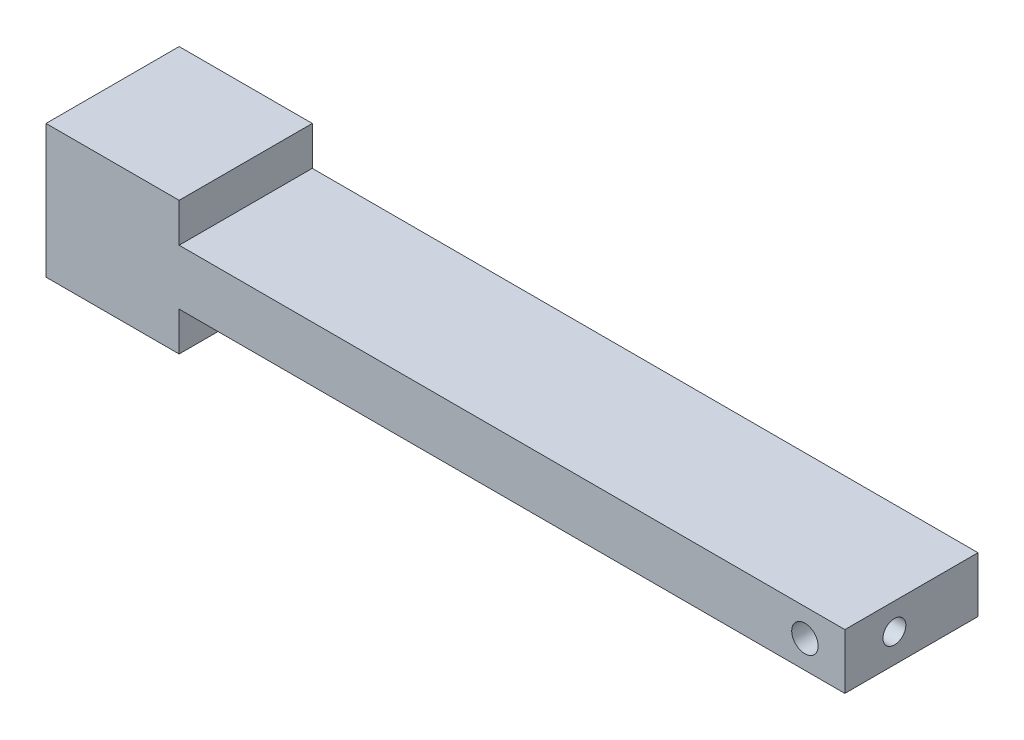
ISO-10303-21;
HEADER;
FILE_DESCRIPTION(('STEP AP214'),'2;1');
FILE_NAME('part.step','',(''),(''),'','','');
FILE_SCHEMA(('AUTOMOTIVE_DESIGN { 1 0 10303 214 1 1 1 1 }'));
ENDSEC;
DATA;
#1=APPLICATION_CONTEXT('core data for automotive mechanical design processes');
#2=APPLICATION_PROTOCOL_DEFINITION('international standard','automotive_design',2000,#1);
#3=PRODUCT_CONTEXT('',#1,'mechanical');
#4=PRODUCT('Part','Part','',(#3));
#5=PRODUCT_RELATED_PRODUCT_CATEGORY('part','',(#4));
#6=PRODUCT_DEFINITION_FORMATION('','',#4);
#7=PRODUCT_DEFINITION_CONTEXT('part definition',#1,'design');
#8=PRODUCT_DEFINITION('design','',#6,#7);
#9=PRODUCT_DEFINITION_SHAPE('','',#8);
#10=(LENGTH_UNIT() NAMED_UNIT(*) SI_UNIT(.MILLI.,.METRE.));
#11=(NAMED_UNIT(*) PLANE_ANGLE_UNIT() SI_UNIT($,.RADIAN.));
#12=(NAMED_UNIT(*) SI_UNIT($,.STERADIAN.) SOLID_ANGLE_UNIT());
#13=UNCERTAINTY_MEASURE_WITH_UNIT(LENGTH_MEASURE(1.E-05),#10,'distance_accuracy_value','');
#14=(GEOMETRIC_REPRESENTATION_CONTEXT(3) GLOBAL_UNCERTAINTY_ASSIGNED_CONTEXT((#13)) GLOBAL_UNIT_ASSIGNED_CONTEXT((#10,
#11,#12)) REPRESENTATION_CONTEXT('',''));
#15=CARTESIAN_POINT('',(0.,0.,0.));
#16=DIRECTION('',(0.,0.,1.));
#17=DIRECTION('',(1.,0.,0.));
#18=AXIS2_PLACEMENT_3D('',#15,#16,#17);
#19=CARTESIAN_POINT('',(40.0000009685755,4.15400019846857,19.9999995541531));
#20=DIRECTION('',(-3.77823637145314E-11,9.00669295250083E-11,1.));
#21=DIRECTION('',(0.,-1.,9.00669295250083E-11));
#22=AXIS2_PLACEMENT_3D('',#19,#20,#21);
#23=PLANE('',#22);
#24=CARTESIAN_POINT('',(94.0004476169617,4.15289091259568,19.9999995561934));
#25=DIRECTION('',(-3.77823637145314E-11,9.00669295250083E-11,1.));
#26=DIRECTION('',(-0.577645664501033,-0.816287624727437,5.16957013741623E-11));
#27=AXIS2_PLACEMENT_3D('',#24,#25,#26);
#28=ELLIPSE('',#27,1.98529051655077,1.98529051504016);
#29=CARTESIAN_POINT('',(92.8536531573011,2.53232283244655,19.9999995562961));
#30=VERTEX_POINT('',#29);
#31=EDGE_CURVE('E64',#30,#30,#28,.T.);
#32=ORIENTED_EDGE('',*,*,#31,.F.);
#33=EDGE_LOOP('',(#32));
#34=FACE_BOUND('',#33,.T.);
#35=DIRECTION('',(0.,-1.,9.00669295250083E-11));
#36=VECTOR('',#35,1.);
#37=CARTESIAN_POINT('',(-19.9999995529652,4.15400019936923,19.9999995518861));
#38=LINE('',#37,#36);
#39=CARTESIAN_POINT('',(-19.9999995529652,-5.84599981084466,19.9999995527868));
#40=VERTEX_POINT('',#39);
#41=CARTESIAN_POINT('',(-19.9999995529652,14.1540002077818,19.9999995509855));
#42=VERTEX_POINT('',#41);
#43=EDGE_CURVE('E135',#40,#42,#38,.F.);
#44=ORIENTED_EDGE('',*,*,#43,.F.);
#45=DIRECTION('',(1.,0.,3.77823637145314E-11));
#46=VECTOR('',#45,1.);
#47=CARTESIAN_POINT('',(-9.9999997768604,-5.84599981084466,19.9999995531646));
#48=LINE('',#47,#46);
#49=CARTESIAN_POINT('',(0.,-5.84599981084466,19.9999995535424));
#50=VERTEX_POINT('',#49);
#51=EDGE_CURVE('E143',#50,#40,#48,.F.);
#52=ORIENTED_EDGE('',*,*,#51,.F.);
#53=DIRECTION('',(0.,-1.,9.00669295250083E-11));
#54=VECTOR('',#53,1.);
#55=CARTESIAN_POINT('',(0.,-2.92299990452166,19.9999995532792));
#56=LINE('',#55,#54);
#57=CARTESIAN_POINT('',(0.,0.,19.9999995530159));
#58=VERTEX_POINT('',#57);
#59=EDGE_CURVE('E194',#58,#50,#56,.T.);
#60=ORIENTED_EDGE('',*,*,#59,.F.);
#61=DIRECTION('',(1.,0.,3.77823637145314E-11));
#62=VECTOR('',#61,1.);
#63=CARTESIAN_POINT('',(50.0000007446802,0.,19.999999554905));
#64=LINE('',#63,#62);
#65=CARTESIAN_POINT('',(100.000001490116,0.,19.9999995567941));
#66=VERTEX_POINT('',#65);
#67=EDGE_CURVE('E198',#66,#58,#64,.F.);
#68=ORIENTED_EDGE('',*,*,#67,.F.);
#69=DIRECTION('',(0.,-1.,9.00669295250083E-11));
#70=VECTOR('',#69,1.);
#71=CARTESIAN_POINT('',(100.000001490116,4.15399996653859,19.99999955642));
#72=LINE('',#71,#70);
#73=CARTESIAN_POINT('',(100.000001490116,8.30799993127584,19.9999995560459));
#74=VERTEX_POINT('',#73);
#75=EDGE_CURVE('E210',#74,#66,#72,.T.);
#76=ORIENTED_EDGE('',*,*,#75,.F.);
#77=DIRECTION('',(-1.,0.,-3.77823637145314E-11));
#78=VECTOR('',#77,1.);
#79=CARTESIAN_POINT('',(50.0000007446802,8.30799993127584,19.9999995541568));
#80=LINE('',#79,#78);
#81=CARTESIAN_POINT('',(0.,8.30799993127584,19.9999995522676));
#82=VERTEX_POINT('',#81);
#83=EDGE_CURVE('E184',#82,#74,#80,.F.);
#84=ORIENTED_EDGE('',*,*,#83,.F.);
#85=DIRECTION('',(0.,-1.,9.00669295250083E-11));
#86=VECTOR('',#85,1.);
#87=CARTESIAN_POINT('',(0.,11.2310000704295,19.9999995520044));
#88=LINE('',#87,#86);
#89=CARTESIAN_POINT('',(0.,14.1540002077818,19.9999995517411));
#90=VERTEX_POINT('',#89);
#91=EDGE_CURVE('E180',#90,#82,#88,.T.);
#92=ORIENTED_EDGE('',*,*,#91,.F.);
#93=DIRECTION('',(-1.,0.,-3.77823637145314E-11));
#94=VECTOR('',#93,1.);
#95=CARTESIAN_POINT('',(-9.9999997768604,14.1540002077818,19.9999995513633));
#96=LINE('',#95,#94);
#97=EDGE_CURVE('E110',#42,#90,#96,.F.);
#98=ORIENTED_EDGE('',*,*,#97,.F.);
#99=EDGE_LOOP('',(#44,#52,#60,#68,#76,#84,#92,#98));
#100=FACE_BOUND('',#99,.T.);
#101=ADVANCED_FACE('F54',(#34,#100),#23,.T.);
#102=CARTESIAN_POINT('',(0.,11.2310000695288,9.99999977648258));
#103=DIRECTION('',(1.,0.,0.));
#104=DIRECTION('',(0.,0.,-1.));
#105=AXIS2_PLACEMENT_3D('',#102,#103,#104);
#106=PLANE('',#105);
#107=DIRECTION('',(0.,0.,-1.));
#108=VECTOR('',#107,1.);
#109=CARTESIAN_POINT('',(0.,8.30799993127584,9.99999977648258));
#110=LINE('',#109,#108);
#111=CARTESIAN_POINT('',(0.,8.30799993127584,-6.53255227689442E-10));
#112=VERTEX_POINT('',#111);
#113=EDGE_CURVE('E95',#112,#82,#110,.F.);
#114=ORIENTED_EDGE('',*,*,#113,.F.);
#115=DIRECTION('',(0.,-1.,1.72519721867234E-10));
#116=VECTOR('',#115,1.);
#117=CARTESIAN_POINT('',(0.,11.2310000678036,-1.15753066853852E-09));
#118=LINE('',#117,#116);
#119=CARTESIAN_POINT('',(0.,14.1540002077818,-1.6618061093876E-09));
#120=VERTEX_POINT('',#119);
#121=EDGE_CURVE('E58',#112,#120,#118,.F.);
#122=ORIENTED_EDGE('',*,*,#121,.T.);
#123=DIRECTION('',(0.,0.,-1.));
#124=VECTOR('',#123,1.);
#125=CARTESIAN_POINT('',(0.,14.1540002077818,9.99999977648258));
#126=LINE('',#125,#124);
#127=EDGE_CURVE('E176',#120,#90,#126,.F.);
#128=ORIENTED_EDGE('',*,*,#127,.T.);
#129=ORIENTED_EDGE('',*,*,#91,.T.);
#130=EDGE_LOOP('',(#114,#122,#128,#129));
#131=FACE_BOUND('',#130,.T.);
#132=ADVANCED_FACE('F256',(#131),#106,.T.);
#133=CARTESIAN_POINT('',(94.0008983016014,4.15352778509259,-7.80098332597845E-05));
#134=DIRECTION('',(-2.25341445740447E-05,-3.18435013226546E-05,0.999999999239102));
#135=DIRECTION('',(0.,-0.999999999492996,-3.18435013307395E-05));
#136=AXIS2_PLACEMENT_3D('',#133,#134,#135);
#137=CYLINDRICAL_SURFACE('',#136,1.98529051504016);
#138=CARTESIAN_POINT('',(92.0213303966296,4.30698918345897,10.840997572822));
#139=CARTESIAN_POINT('',(92.027738209865,4.38935505976686,10.8410049353294));
#140=CARTESIAN_POINT('',(92.03933057658,4.4714053608794,10.8469823661287));
#141=CARTESIAN_POINT('',(92.0722083565678,4.63196335916795,10.8701069849026));
#142=CARTESIAN_POINT('',(92.0935127024591,4.71046380613461,10.8872760181225));
#143=CARTESIAN_POINT('',(92.1442174303557,4.8612106656572,10.9311386446164));
#144=CARTESIAN_POINT('',(92.1735553015237,4.93349992459879,10.9577591496137));
#145=CARTESIAN_POINT('',(92.2387921134833,5.07136199407739,11.0189140991926));
#146=CARTESIAN_POINT('',(92.2746915954768,5.13693424989907,11.0534491966297));
#147=CARTESIAN_POINT('',(92.3687227814682,5.28865864754151,11.1458444358875));
#148=CARTESIAN_POINT('',(92.4296281088826,5.370942306804,11.2072372257263));
#149=CARTESIAN_POINT('',(92.558145026261,5.52078480155987,11.3402953090276));
#150=CARTESIAN_POINT('',(92.6257753051906,5.58830083371534,11.4119894909735));
#151=CARTESIAN_POINT('',(92.7660524846574,5.71072787367784,11.5657669799297));
#152=CARTESIAN_POINT('',(92.8387846596546,5.76525937410873,11.6480744606328));
#153=CARTESIAN_POINT('',(92.9467214224429,5.83615937984344,11.7781012538733));
#154=CARTESIAN_POINT('',(92.9824760749675,5.85796222476029,11.8224961994024));
#155=CARTESIAN_POINT('',(93.052670587892,5.89796142998643,11.9138588112465));
#156=CARTESIAN_POINT('',(93.087111484775,5.91616068292434,11.9608243751332));
#157=CARTESIAN_POINT('',(93.146624184707,5.94561039634848,12.0484202705445));
#158=CARTESIAN_POINT('',(93.1722058171645,5.95752351241561,12.0884780862943));
#159=CARTESIAN_POINT('',(93.2201066608229,5.97875044831453,12.1712370798607));
#160=CARTESIAN_POINT('',(93.2424257575983,5.98806417698947,12.2139383503155));
#161=CARTESIAN_POINT('',(93.2776205739836,6.00217362000559,12.2939928119583));
#162=CARTESIAN_POINT('',(93.291486295163,6.00749307055044,12.3308031441124));
#163=CARTESIAN_POINT('',(93.3135584574533,6.01578363862988,12.4062883060213));
#164=CARTESIAN_POINT('',(93.3217854455289,6.01876328800818,12.4449558110389));
#165=CARTESIAN_POINT('',(93.3309164307503,6.02206210278586,12.5238292036585));
#166=CARTESIAN_POINT('',(93.331725793991,6.0223468886562,12.5640484144963));
#167=CARTESIAN_POINT('',(93.3255396993505,6.02011755088474,12.6438223891513));
#168=CARTESIAN_POINT('',(93.3185299365359,6.01759829732769,12.6833758003233));
#169=CARTESIAN_POINT('',(93.2959136337359,6.00917893088506,12.7699747053243));
#170=CARTESIAN_POINT('',(93.2786245135109,6.0026029185691,12.8164881569458));
#171=CARTESIAN_POINT('',(93.2382613379378,5.98633294310751,12.9064054225882));
#172=CARTESIAN_POINT('',(93.215162208446,5.9766254126568,12.9497946817207));
#173=CARTESIAN_POINT('',(93.1632646907293,5.95342556227288,13.0380577171385));
#174=CARTESIAN_POINT('',(93.1341286246761,5.93965394635518,13.0826541726011));
#175=CARTESIAN_POINT('',(93.0737569228028,5.90909568603756,13.1693457886071));
#176=CARTESIAN_POINT('',(93.0425190185769,5.89230575037178,13.2114381512553));
#177=CARTESIAN_POINT('',(92.9472920209854,5.83752095411522,13.3347114804561));
#178=CARTESIAN_POINT('',(92.8818283119401,5.7951272094196,13.412830030942));
#179=CARTESIAN_POINT('',(92.7419861693271,5.69128424426149,13.5733069210783));
#180=CARTESIAN_POINT('',(92.6677398773525,5.62793268818409,13.6545499796976));
#181=CARTESIAN_POINT('',(92.5247616543543,5.48482132953397,13.8067148432776));
#182=CARTESIAN_POINT('',(92.456018474537,5.40509625103739,13.8776579570345));
#183=CARTESIAN_POINT('',(92.345232104433,5.25199908949161,13.9892087001723));
#184=CARTESIAN_POINT('',(92.3009305307541,5.1825036863088,14.0328809736327));
#185=CARTESIAN_POINT('',(92.219725119699,5.03456816627114,14.111078601178));
#186=CARTESIAN_POINT('',(92.1828127400084,4.956138544453,14.1456145324089));
#187=CARTESIAN_POINT('',(92.1236915483699,4.8044009841975,14.1987534942452));
#188=CARTESIAN_POINT('',(92.1000841366074,4.73222210889643,14.2190067025169));
#189=CARTESIAN_POINT('',(92.061039862106,4.58371652266952,14.2500495013133));
#190=CARTESIAN_POINT('',(92.0455978915665,4.50739243776512,14.2608450107785));
#191=CARTESIAN_POINT('',(92.0237582292718,4.35236278699525,14.2719949724837));
#192=CARTESIAN_POINT('',(92.0173976801946,4.27364877809186,14.272306662764));
#193=CARTESIAN_POINT('',(92.0140685111104,4.11673344128202,14.2620546010926));
#194=CARTESIAN_POINT('',(92.0170999148315,4.03853211467134,14.2514908216648));
#195=CARTESIAN_POINT('',(92.0314475617143,3.89021556708383,14.2210236351779));
#196=CARTESIAN_POINT('',(92.0422059838271,3.8199067508243,14.2017799615739));
#197=CARTESIAN_POINT('',(92.0703652309547,3.68349453617198,14.1550978621988));
#198=CARTESIAN_POINT('',(92.0877676814574,3.61739217152505,14.1276574314164));
#199=CARTESIAN_POINT('',(92.1297800569342,3.48468160962329,14.0627930715323));
#200=CARTESIAN_POINT('',(92.1549002825522,3.41857059781703,14.0246896942043));
#201=CARTESIAN_POINT('',(92.2098246813798,3.29328977982566,13.9412017866257));
#202=CARTESIAN_POINT('',(92.2396312653027,3.23412357363458,13.8958135086917));
#203=CARTESIAN_POINT('',(92.3087120941268,3.11152627276729,13.7886886781335));
#204=CARTESIAN_POINT('',(92.3486698572646,3.04974124246974,13.7255121160814));
#205=CARTESIAN_POINT('',(92.4299667963198,2.9368062736538,13.5909339105132));
#206=CARTESIAN_POINT('',(92.4713077505971,2.88567068875152,13.5195213650543));
#207=CARTESIAN_POINT('',(92.5493068571313,2.79722994533939,13.3734711134498));
#208=CARTESIAN_POINT('',(92.5860965876383,2.75926665698403,13.2993033959886));
#209=CARTESIAN_POINT('',(92.6537059324242,2.69384438938311,13.1439353113346));
#210=CARTESIAN_POINT('',(92.6845386964181,2.66636213994731,13.0627510202673));
#211=CARTESIAN_POINT('',(92.7273510040933,2.62971452835751,12.9185149747004));
#212=CARTESIAN_POINT('',(92.7422071771655,2.6175427600528,12.8571052089105));
#213=CARTESIAN_POINT('',(92.7639576557527,2.59997434447804,12.7319968811869));
#214=CARTESIAN_POINT('',(92.770869414347,2.59456284329881,12.6683036547041));
#215=CARTESIAN_POINT('',(92.7754749032408,2.59094374522096,12.5400761162616));
#216=CARTESIAN_POINT('',(92.7731279960037,2.59276790681609,12.4755393383103));
#217=CARTESIAN_POINT('',(92.7595977072045,2.60351896108005,12.3479708402922));
#218=CARTESIAN_POINT('',(92.7484000113996,2.6124573596571,12.2849417288212));
#219=CARTESIAN_POINT('',(92.7146414903433,2.6404519803462,12.1432769694936));
#220=CARTESIAN_POINT('',(92.6896696647932,2.66174919317962,12.0656796350652));
#221=CARTESIAN_POINT('',(92.6327289050362,2.71380292574242,11.9163957775586));
#222=CARTESIAN_POINT('',(92.6007377940588,2.74458955407794,11.8447290027877));
#223=CARTESIAN_POINT('',(92.5209434154715,2.82788666538825,11.6815850306647));
#224=CARTESIAN_POINT('',(92.4717090896213,2.88421426587905,11.5927560300024));
#225=CARTESIAN_POINT('',(92.3739697891802,3.0121894754502,11.4265766020635));
#226=CARTESIAN_POINT('',(92.3254643491604,3.08382682118419,11.3492185434569));
#227=CARTESIAN_POINT('',(92.2429607975443,3.22720059106249,11.2208434600181));
#228=CARTESIAN_POINT('',(92.2079528173076,3.29636392914107,11.1676107983989));
#229=CARTESIAN_POINT('',(92.1445545783634,3.44414202995463,11.0712652960687));
#230=CARTESIAN_POINT('',(92.1161550634513,3.52274333634721,11.0281383001691));
#231=CARTESIAN_POINT('',(92.0726874167448,3.67416192730843,10.9602481911912));
#232=CARTESIAN_POINT('',(92.0561797723851,3.74572489669781,10.9336157451265));
#233=CARTESIAN_POINT('',(92.0310761737774,3.89300168185002,10.8899548197083));
#234=CARTESIAN_POINT('',(92.0224653426652,3.96870740660677,10.8729083048924));
#235=CARTESIAN_POINT('',(92.0159376375952,4.08863549231317,10.8543900446725));
#236=CARTESIAN_POINT('',(92.0149944886588,4.13218679669448,10.8493680421251));
#237=CARTESIAN_POINT('',(92.0159911454471,4.21951803981058,10.842669617975));
#238=CARTESIAN_POINT('',(92.0179313569666,4.26329800986291,10.8409936673626));
#239=CARTESIAN_POINT('',(92.0213303966296,4.30698918345897,10.840997572822));
#240=B_SPLINE_CURVE_WITH_KNOTS('',3,(#138,#139,#140,#141,#142,#143,#144,#145,#146,#147,#148,
#149,#150,#151,#152,#153,#154,#155,#156,#157,#158,#159,#160,#161,#162,#163,#164,#165,#166,#167,
#168,#169,#170,#171,#172,#173,#174,#175,#176,#177,#178,#179,#180,#181,#182,#183,#184,#185,#186,
#187,#188,#189,#190,#191,#192,#193,#194,#195,#196,#197,#198,#199,#200,#201,#202,#203,#204,#205,
#206,#207,#208,#209,#210,#211,#212,#213,#214,#215,#216,#217,#218,#219,#220,#221,#222,#223,#224,
#225,#226,#227,#228,#229,#230,#231,#232,#233,#234,#235,#236,#237,#238,#239),.UNSPECIFIED.,.T.,
.F.,(4,2,2,2,2,2,2,2,2,2,2,2,2,2,2,2,2,2,2,2,2,2,2,2,2,2,2,2,2,2,2,2,2,2,2,2,2,2,2,2,2,2,2,2,2,
2,2,2,2,2,4),(0.,0.247648462571328,0.495781771438758,0.742036622718724,0.988311794281035,
1.3444499897393,1.70160714576746,2.06818615462612,2.25115671375789,2.43397980036377,
2.58081876073379,2.72766286989156,2.8463721347269,2.96464650203743,3.08442774285187,
3.20442848095991,3.35376275100567,3.50375290273325,3.66857158740325,3.83357109763575,
4.16378447595075,4.54341930573182,4.92225718974084,5.20110994821745,5.47963845184876,
5.71443861330787,5.94909172387431,6.18470183447159,6.4203125403229,6.64043217036471,
6.86060568808923,7.1007350216334,7.34098828690419,7.63089889416151,7.92119775755323,
8.19360601278087,8.46540589170696,8.65770493413698,8.84958070255151,9.04229957460601,
9.23533076722079,9.48668298131446,9.73884105676556,10.0855507200529,10.4320286811615,
10.7130809433655,10.9937371453484,11.2271400063461,11.4601022492655,11.5914494739296,
11.722815185727),.UNSPECIFIED.);
#241=CARTESIAN_POINT('',(92.0213303966296,4.30698918345897,10.840997572822));
#242=VERTEX_POINT('',#241);
#243=EDGE_CURVE('E218',#242,#242,#240,.T.);
#244=ORIENTED_EDGE('',*,*,#243,.F.);
#245=EDGE_LOOP('',(#244));
#246=FACE_BOUND('',#245,.T.);
#247=CARTESIAN_POINT('',(95.9799776180645,4.30698918345897,10.840997572822));
#248=CARTESIAN_POINT('',(95.9860915322943,4.22829971138774,10.8409985715823));
#249=CARTESIAN_POINT('',(95.9874777103816,4.14923295805796,10.8464504498645));
#250=CARTESIAN_POINT('',(95.9810161694454,3.99298421957096,10.8681441643114));
#251=CARTESIAN_POINT('',(95.973165424143,3.91580286058115,10.8843895359722));
#252=CARTESIAN_POINT('',(95.9492901318784,3.76598396084882,10.9267155194715));
#253=CARTESIAN_POINT('',(95.933305579454,3.69332612132768,10.9527478460646));
#254=CARTESIAN_POINT('',(95.8946431210275,3.55365006008611,11.0134391317675));
#255=CARTESIAN_POINT('',(95.8719616288368,3.48663488476717,11.0481027113219));
#256=CARTESIAN_POINT('',(95.8132785973153,3.33830613795017,11.1373476514968));
#257=CARTESIAN_POINT('',(95.7753450381974,3.25944973067834,11.1947386360714));
#258=CARTESIAN_POINT('',(95.6942235663009,3.11387256397802,11.3203200317625));
#259=CARTESIAN_POINT('',(95.6510245092046,3.04717831658793,11.3885334436252));
#260=CARTESIAN_POINT('',(95.5625063825678,2.92527510715481,11.5355793747854));
#261=CARTESIAN_POINT('',(95.517164258279,2.87027061762383,11.6145665805213));
#262=CARTESIAN_POINT('',(95.4297732187303,2.77360620873031,11.7819642980681));
#263=CARTESIAN_POINT('',(95.3877190784874,2.73192477793723,11.8703593092007));
#264=CARTESIAN_POINT('',(95.3265734699006,2.67519002615395,12.024521147804));
#265=CARTESIAN_POINT('',(95.3045676208009,2.65591193451794,12.0875592691009));
#266=CARTESIAN_POINT('',(95.2676122790774,2.62450987442688,12.2173332467013));
#267=CARTESIAN_POINT('',(95.2526460797145,2.61236895050309,12.284059923892));
#268=CARTESIAN_POINT('',(95.2322553091335,2.59600713870518,12.4208085727007));
#269=CARTESIAN_POINT('',(95.2269423264279,2.59187883777738,12.4908595943113));
#270=CARTESIAN_POINT('',(95.227458186236,2.59228281496815,12.6308958283613));
#271=CARTESIAN_POINT('',(95.2332882041242,2.59681600670919,12.7008810330793));
#272=CARTESIAN_POINT('',(95.2554396127535,2.61462045736827,12.842770614814));
#273=CARTESIAN_POINT('',(95.2724342462025,2.62845387970381,12.9144920979904));
#274=CARTESIAN_POINT('',(95.3141975937577,2.66428593044103,13.0535559935042));
#275=CARTESIAN_POINT('',(95.3389896456191,2.6863091074319,13.1208845174908));
#276=CARTESIAN_POINT('',(95.4056321205979,2.74946280972317,13.2808262394072));
#277=CARTESIAN_POINT('',(95.4500662131481,2.79471901424552,13.3707149208825));
#278=CARTESIAN_POINT('',(95.5414615513268,2.89931671905957,13.5404657257385));
#279=CARTESIAN_POINT('',(95.5884264174857,2.95867883644833,13.6203129088267));
#280=CARTESIAN_POINT('',(95.6811214602273,3.09289011474994,13.7713830079487));
#281=CARTESIAN_POINT('',(95.7267864637607,3.16810624345256,13.8423231303374));
#282=CARTESIAN_POINT('',(95.8107302979362,3.33258186870659,13.9709371450733));
#283=CARTESIAN_POINT('',(95.849029154964,3.42180205609289,14.0286470908992));
#284=CARTESIAN_POINT('',(95.9042006749714,3.5849896221404,14.1133060314457));
#285=CARTESIAN_POINT('',(95.9240651715442,3.65584017068993,14.1443195160127));
#286=CARTESIAN_POINT('',(95.9561347047198,3.80264108584915,14.1968360167636));
#287=CARTESIAN_POINT('',(95.9683456353947,3.87858747808447,14.2183463476245));
#288=CARTESIAN_POINT('',(95.983841290634,4.03403756008495,14.2508367186398));
#289=CARTESIAN_POINT('',(95.9870795942834,4.11355759459004,14.2617618063326));
#290=CARTESIAN_POINT('',(95.9838377119619,4.27314929182768,14.272357364178));
#291=CARTESIAN_POINT('',(95.9773590425518,4.35322086653811,14.2720295904279));
#292=CARTESIAN_POINT('',(95.9558381034586,4.50481967177133,14.2609387700889));
#293=CARTESIAN_POINT('',(95.9415250103883,4.57651681916942,14.2510155103703));
#294=CARTESIAN_POINT('',(95.9056583772922,4.71633317014532,14.2227855287242));
#295=CARTESIAN_POINT('',(95.8841032545726,4.78445158785108,14.2044769739325));
#296=CARTESIAN_POINT('',(95.8331594224319,4.92030660024525,14.159112274718));
#297=CARTESIAN_POINT('',(95.8033423331076,4.98771127012325,14.1315518590619));
#298=CARTESIAN_POINT('',(95.7380599834195,5.1162799581379,14.0695466115677));
#299=CARTESIAN_POINT('',(95.7025922327777,5.17744120517332,14.0350987426759));
#300=CARTESIAN_POINT('',(95.6065012374918,5.32521632461112,13.9399562795995));
#301=CARTESIAN_POINT('',(95.542793991233,5.40726000486183,13.8752654075051));
#302=CARTESIAN_POINT('',(95.4088503094003,5.55602780285784,13.7354579371028));
#303=CARTESIAN_POINT('',(95.3385922871982,5.62269856301158,13.6603064362732));
#304=CARTESIAN_POINT('',(95.2304129740311,5.71232579690707,13.5400586943438));
#305=CARTESIAN_POINT('',(95.1933870736481,5.7407704347213,13.4981256632098));
#306=CARTESIAN_POINT('',(95.1192827136257,5.79382966355254,13.4119524938236));
#307=CARTESIAN_POINT('',(95.0822042729488,5.81844539399635,13.3677130471792));
#308=CARTESIAN_POINT('',(95.0088871514533,5.86383216040556,13.2768497521032));
#309=CARTESIAN_POINT('',(94.9726466300024,5.88461250086371,13.2302320338811));
#310=CARTESIAN_POINT('',(94.902161127143,5.92233447295693,13.1340688479744));
#311=CARTESIAN_POINT('',(94.8679137076584,5.93928087105955,13.0845271132596));
#312=CARTESIAN_POINT('',(94.8115457422917,5.96542489809403,12.9942685193217));
#313=CARTESIAN_POINT('',(94.7885159604189,5.97550301301433,12.9543836029615));
#314=CARTESIAN_POINT('',(94.746595938071,5.99306177368908,12.8719293297514));
#315=CARTESIAN_POINT('',(94.7276987006287,6.00054682261639,12.8293646699842));
#316=CARTESIAN_POINT('',(94.7004249703154,6.01102450000831,12.7517333351973));
#317=CARTESIAN_POINT('',(94.6906172021587,6.01466098095506,12.717274796892));
#318=CARTESIAN_POINT('',(94.6765036912545,6.01983611015202,12.6471241448799));
#319=CARTESIAN_POINT('',(94.672183470634,6.02138027929987,12.6114355333984));
#320=CARTESIAN_POINT('',(94.6698953277961,6.02220469526983,12.5396311660552));
#321=CARTESIAN_POINT('',(94.6719600494069,6.02147330790369,12.5035141587041));
#322=CARTESIAN_POINT('',(94.6820650316463,6.01781271326931,12.4322189623534));
#323=CARTESIAN_POINT('',(94.6901184255373,6.01487867541503,12.3970430130213));
#324=CARTESIAN_POINT('',(94.7158893342799,6.00517044102142,12.3113997616302));
#325=CARTESIAN_POINT('',(94.7364141029495,5.99721604494811,12.2619456838106));
#326=CARTESIAN_POINT('',(94.7832588955219,5.97783439547955,12.1665534427582));
#327=CARTESIAN_POINT('',(94.8096042852142,5.96639185548136,12.1206318929211));
#328=CARTESIAN_POINT('',(94.8685973637718,5.93897355596418,12.0265493838378));
#329=CARTESIAN_POINT('',(94.9016213764983,5.92262798035051,11.9787374330387));
#330=CARTESIAN_POINT('',(94.9695576191447,5.88636837279551,11.8858513127558));
#331=CARTESIAN_POINT('',(95.004471811229,5.86645058101016,11.8407800955437));
#332=CARTESIAN_POINT('',(95.0750851652643,5.82307934931429,11.7529144361076));
#333=CARTESIAN_POINT('',(95.1107852581284,5.79962149970437,11.7101229248518));
#334=CARTESIAN_POINT('',(95.1821906114274,5.74915933185531,11.6266890036375));
#335=CARTESIAN_POINT('',(95.2178958720481,5.72215473621044,11.5860467621314));
#336=CARTESIAN_POINT('',(95.2927991318446,5.66123534980442,11.50238365237));
#337=CARTESIAN_POINT('',(95.3319318833102,5.62688384722111,11.4596189095175));
#338=CARTESIAN_POINT('',(95.408848932977,5.55358090899746,11.3769295596888));
#339=CARTESIAN_POINT('',(95.4466328026023,5.51462802802014,11.3370058514526));
#340=CARTESIAN_POINT('',(95.5568122115574,5.39085357172227,11.2221997057461));
#341=CARTESIAN_POINT('',(95.6263784172211,5.29884865171217,11.1519063529333));
#342=CARTESIAN_POINT('',(95.7299807752245,5.13135906411776,11.0501493242232));
#343=CARTESIAN_POINT('',(95.7679486363247,5.06129695850054,11.0136920021363));
#344=CARTESIAN_POINT('',(95.8363019410007,4.91367329341151,10.9498898902751));
#345=CARTESIAN_POINT('',(95.8666959341836,4.8361203283872,10.9225348138069));
#346=CARTESIAN_POINT('',(95.9150377474426,4.68431271724347,10.8813955782379));
#347=CARTESIAN_POINT('',(95.9340201089747,4.61071838435308,10.8664055947041));
#348=CARTESIAN_POINT('',(95.9634986050235,4.46053174558226,10.846208401273));
#349=CARTESIAN_POINT('',(95.9739987244501,4.38394086521486,10.8409965961185));
#350=CARTESIAN_POINT('',(95.9799776180645,4.30698918345897,10.840997572822));
#351=B_SPLINE_CURVE_WITH_KNOTS('',3,(#247,#248,#249,#250,#251,#252,#253,#254,#255,#256,#257,
#258,#259,#260,#261,#262,#263,#264,#265,#266,#267,#268,#269,#270,#271,#272,#273,#274,#275,#276,
#277,#278,#279,#280,#281,#282,#283,#284,#285,#286,#287,#288,#289,#290,#291,#292,#293,#294,#295,
#296,#297,#298,#299,#300,#301,#302,#303,#304,#305,#306,#307,#308,#309,#310,#311,#312,#313,#314,
#315,#316,#317,#318,#319,#320,#321,#322,#323,#324,#325,#326,#327,#328,#329,#330,#331,#332,#333,
#334,#335,#336,#337,#338,#339,#340,#341,#342,#343,#344,#345,#346,#347,#348,#349,#350),
.UNSPECIFIED.,.T.,.F.,(4,2,2,2,2,2,2,2,2,2,2,2,2,2,2,2,2,2,2,2,2,2,2,2,2,2,2,2,2,2,2,2,2,2,2,2,
2,2,2,2,2,2,2,2,2,2,2,2,2,2,2,4),(0.,0.23646875458468,0.473015004635537,0.708409219160652,
0.943929715817728,1.25620053447853,1.56914413420811,1.88717822837393,2.20469619953327,
2.41255293597138,2.61991385924396,2.82965692669796,3.03942211927114,3.26316580702849,
3.4875856390729,3.81590078401682,4.14469877592282,4.48216327269054,4.81869691586332,
5.05729795882115,5.2957150267163,5.53536328981036,5.77497415408531,5.99535064132316,
6.21577532163056,6.45098140921349,6.6862914416368,7.05140287090765,7.41776309787834,
7.60590551480666,7.79399183574672,7.98161569119164,8.16900498952662,8.31023879709116,
8.45123159243525,8.55887208407912,8.66622799240449,8.77413367724641,8.88227670159904,
9.04374751658772,9.2059363975613,9.3867619481234,9.56777895098669,9.74902332919545,
9.93028189173109,10.1321802879595,10.3341422718887,10.7363622390816,10.9983606933761,
11.2600620424483,11.4914173376871,11.7226638801921),.UNSPECIFIED.);
#352=CARTESIAN_POINT('',(95.9799776180645,4.30698918345897,10.840997572822));
#353=VERTEX_POINT('',#352);
#354=EDGE_CURVE('E222',#353,#353,#351,.T.);
#355=ORIENTED_EDGE('',*,*,#354,.F.);
#356=EDGE_LOOP('',(#355));
#357=FACE_BOUND('',#356,.T.);
#358=CARTESIAN_POINT('',(94.0008982998435,4.15352778260849,-2.0793267443335E-10));
#359=DIRECTION('',(2.88725500096346E-12,1.72519721867234E-10,1.));
#360=DIRECTION('',(-0.577645362546507,-0.816287838405372,1.42493560307096E-10));
#361=AXIS2_PLACEMENT_3D('',#358,#359,#360);
#362=ELLIPSE('',#361,1.98529051655077,1.98529051504016);
#363=CARTESIAN_POINT('',(92.8541044396504,2.53295927824658,7.49584395138834E-11));
#364=VERTEX_POINT('',#363);
#365=EDGE_CURVE('E12',#364,#364,#362,.F.);
#366=ORIENTED_EDGE('',*,*,#365,.T.);
#367=EDGE_LOOP('',(#366));
#368=FACE_BOUND('',#367,.T.);
#369=ORIENTED_EDGE('',*,*,#31,.T.);
#370=EDGE_LOOP('',(#369));
#371=FACE_BOUND('',#370,.T.);
#372=ADVANCED_FACE('F238',(#246,#357,#368,#371),#137,.F.);
#373=CARTESIAN_POINT('',(-9.99999977648258,14.1540002077818,9.99999977648258));
#374=DIRECTION('',(0.,-1.,0.));
#375=DIRECTION('',(0.,0.,-1.));
#376=AXIS2_PLACEMENT_3D('',#373,#374,#375);
#377=PLANE('',#376);
#378=ORIENTED_EDGE('',*,*,#127,.F.);
#379=DIRECTION('',(-1.,0.,2.88725500096346E-12));
#380=VECTOR('',#379,1.);
#381=CARTESIAN_POINT('',(-9.99999977651145,14.1540002077818,-1.63293337185344E-09));
#382=LINE('',#381,#380);
#383=CARTESIAN_POINT('',(-19.9999995529652,14.1540002077818,-1.60406063431928E-09));
#384=VERTEX_POINT('',#383);
#385=EDGE_CURVE('E102',#120,#384,#382,.T.);
#386=ORIENTED_EDGE('',*,*,#385,.T.);
#387=DIRECTION('',(0.,0.,1.));
#388=VECTOR('',#387,1.);
#389=CARTESIAN_POINT('',(-19.9999995529652,14.1540002077818,9.99999977648258));
#390=LINE('',#389,#388);
#391=EDGE_CURVE('E148',#384,#42,#390,.T.);
#392=ORIENTED_EDGE('',*,*,#391,.T.);
#393=ORIENTED_EDGE('',*,*,#97,.T.);
#394=EDGE_LOOP('',(#378,#386,#392,#393));
#395=FACE_BOUND('',#394,.T.);
#396=ADVANCED_FACE('F265',(#395),#377,.F.);
#397=CARTESIAN_POINT('',(-19.9999995529652,4.15400019846857,9.99999977648258));
#398=DIRECTION('',(1.,0.,0.));
#399=DIRECTION('',(0.,0.,-1.));
#400=AXIS2_PLACEMENT_3D('',#397,#398,#399);
#401=PLANE('',#400);
#402=CARTESIAN_POINT('',(-19.9999995529652,4.30698918345897,12.5559131160182));
#403=DIRECTION('',(1.,0.,0.));
#404=DIRECTION('',(0.,0.,-1.));
#405=AXIS2_PLACEMENT_3D('',#402,#403,#404);
#406=CIRCLE('',#405,1.71491554319615);
#407=CARTESIAN_POINT('',(-19.9999995529652,4.30698918345897,10.840997572822));
#408=VERTEX_POINT('',#407);
#409=EDGE_CURVE('E227',#408,#408,#406,.F.);
#410=ORIENTED_EDGE('',*,*,#409,.F.);
#411=EDGE_LOOP('',(#410));
#412=FACE_BOUND('',#411,.T.);
#413=DIRECTION('',(0.,0.,-1.));
#414=VECTOR('',#413,1.);
#415=CARTESIAN_POINT('',(-19.9999995529652,-5.84599981084466,9.99999977648258));
#416=LINE('',#415,#414);
#417=CARTESIAN_POINT('',(-19.9999995529652,-5.84599981084466,1.84633384969768E-09));
#418=VERTEX_POINT('',#417);
#419=EDGE_CURVE('E140',#40,#418,#416,.T.);
#420=ORIENTED_EDGE('',*,*,#419,.F.);
#421=ORIENTED_EDGE('',*,*,#43,.T.);
#422=ORIENTED_EDGE('',*,*,#391,.F.);
#423=DIRECTION('',(0.,-1.,1.72519721867234E-10));
#424=VECTOR('',#423,1.);
#425=CARTESIAN_POINT('',(-19.9999995529652,4.15400019674337,1.2113574032746E-10));
#426=LINE('',#425,#424);
#427=EDGE_CURVE('E130',#384,#418,#426,.T.);
#428=ORIENTED_EDGE('',*,*,#427,.T.);
#429=EDGE_LOOP('',(#420,#421,#422,#428));
#430=FACE_BOUND('',#429,.T.);
#431=ADVANCED_FACE('F147',(#412,#430),#401,.F.);
#432=CARTESIAN_POINT('',(-9.99999977648258,-5.84599981084466,9.99999977648258));
#433=DIRECTION('',(0.,1.,0.));
#434=DIRECTION('',(0.,0.,1.));
#435=AXIS2_PLACEMENT_3D('',#432,#433,#434);
#436=PLANE('',#435);
#437=ORIENTED_EDGE('',*,*,#419,.T.);
#438=DIRECTION('',(1.,0.,-2.88725500096346E-12));
#439=VECTOR('',#438,1.);
#440=CARTESIAN_POINT('',(-9.99999977651145,-5.84599981084466,1.81746111216352E-09));
#441=LINE('',#440,#439);
#442=CARTESIAN_POINT('',(0.,-5.84599981084466,1.78858837462936E-09));
#443=VERTEX_POINT('',#442);
#444=EDGE_CURVE('E73',#418,#443,#441,.T.);
#445=ORIENTED_EDGE('',*,*,#444,.T.);
#446=DIRECTION('',(0.,0.,1.));
#447=VECTOR('',#446,1.);
#448=CARTESIAN_POINT('',(0.,-5.84599981084466,9.99999977648258));
#449=LINE('',#448,#447);
#450=EDGE_CURVE('E136',#50,#443,#449,.F.);
#451=ORIENTED_EDGE('',*,*,#450,.F.);
#452=ORIENTED_EDGE('',*,*,#51,.T.);
#453=EDGE_LOOP('',(#437,#445,#451,#452));
#454=FACE_BOUND('',#453,.T.);
#455=ADVANCED_FACE('F141',(#454),#436,.F.);
#456=CARTESIAN_POINT('',(0.,-2.92299990542233,9.99999977648258));
#457=DIRECTION('',(1.,0.,0.));
#458=DIRECTION('',(0.,0.,-1.));
#459=AXIS2_PLACEMENT_3D('',#456,#457,#458);
#460=PLANE('',#459);
#461=ORIENTED_EDGE('',*,*,#59,.T.);
#462=ORIENTED_EDGE('',*,*,#450,.T.);
#463=DIRECTION('',(0.,-1.,1.72519721867234E-10));
#464=VECTOR('',#463,1.);
#465=CARTESIAN_POINT('',(0.,-2.92299990714753,1.28431293378028E-09));
#466=LINE('',#465,#464);
#467=CARTESIAN_POINT('',(0.,0.,7.80037492931207E-10));
#468=VERTEX_POINT('',#467);
#469=EDGE_CURVE('E133',#443,#468,#466,.F.);
#470=ORIENTED_EDGE('',*,*,#469,.T.);
#471=DIRECTION('',(0.,0.,1.));
#472=VECTOR('',#471,1.);
#473=CARTESIAN_POINT('',(0.,0.,9.99999977648258));
#474=LINE('',#473,#472);
#475=EDGE_CURVE('E162',#58,#468,#474,.F.);
#476=ORIENTED_EDGE('',*,*,#475,.F.);
#477=EDGE_LOOP('',(#461,#462,#470,#476));
#478=FACE_BOUND('',#477,.T.);
#479=ADVANCED_FACE('F273',(#478),#460,.T.);
#480=CARTESIAN_POINT('',(50.0000007450581,0.,9.99999977648258));
#481=DIRECTION('',(0.,1.,0.));
#482=DIRECTION('',(0.,0.,1.));
#483=AXIS2_PLACEMENT_3D('',#480,#481,#482);
#484=PLANE('',#483);
#485=ORIENTED_EDGE('',*,*,#475,.T.);
#486=DIRECTION('',(1.,0.,-2.88725500096346E-12));
#487=VECTOR('',#486,1.);
#488=CARTESIAN_POINT('',(50.0000007450292,0.,6.35675539983893E-10));
#489=LINE('',#488,#487);
#490=CARTESIAN_POINT('',(100.000001490116,0.,4.91311852313103E-10));
#491=VERTEX_POINT('',#490);
#492=EDGE_CURVE('E159',#468,#491,#489,.T.);
#493=ORIENTED_EDGE('',*,*,#492,.T.);
#494=DIRECTION('',(0.,0.,1.));
#495=VECTOR('',#494,1.);
#496=CARTESIAN_POINT('',(100.000001490116,0.,9.99999977648258));
#497=LINE('',#496,#495);
#498=EDGE_CURVE('E167',#66,#491,#497,.F.);
#499=ORIENTED_EDGE('',*,*,#498,.F.);
#500=ORIENTED_EDGE('',*,*,#67,.T.);
#501=EDGE_LOOP('',(#485,#493,#499,#500));
#502=FACE_BOUND('',#501,.T.);
#503=ADVANCED_FACE('F276',(#502),#484,.F.);
#504=CARTESIAN_POINT('',(50.0000007450581,8.30799993127584,9.99999977648258));
#505=DIRECTION('',(0.,-1.,0.));
#506=DIRECTION('',(0.,0.,-1.));
#507=AXIS2_PLACEMENT_3D('',#504,#505,#506);
#508=PLANE('',#507);
#509=DIRECTION('',(-1.,0.,2.88725500096346E-12));
#510=VECTOR('',#509,1.);
#511=CARTESIAN_POINT('',(50.0000007450292,8.30799993127584,-7.97618915360232E-10));
#512=LINE('',#511,#510);
#513=CARTESIAN_POINT('',(100.000001490116,8.30799993127584,-9.41980868307546E-10));
#514=VERTEX_POINT('',#513);
#515=EDGE_CURVE('E166',#514,#112,#512,.T.);
#516=ORIENTED_EDGE('',*,*,#515,.T.);
#517=ORIENTED_EDGE('',*,*,#113,.T.);
#518=ORIENTED_EDGE('',*,*,#83,.T.);
#519=DIRECTION('',(0.,0.,-1.));
#520=VECTOR('',#519,1.);
#521=CARTESIAN_POINT('',(100.000001490116,8.30799993127584,9.99999977648258));
#522=LINE('',#521,#520);
#523=EDGE_CURVE('E214',#514,#74,#522,.F.);
#524=ORIENTED_EDGE('',*,*,#523,.F.);
#525=EDGE_LOOP('',(#516,#517,#518,#524));
#526=FACE_BOUND('',#525,.T.);
#527=ADVANCED_FACE('F280',(#526),#508,.F.);
#528=CARTESIAN_POINT('',(100.000001490116,4.15399996563792,9.99999977648258));
#529=DIRECTION('',(1.,0.,0.));
#530=DIRECTION('',(0.,0.,-1.));
#531=AXIS2_PLACEMENT_3D('',#528,#529,#530);
#532=PLANE('',#531);
#533=CARTESIAN_POINT('',(100.,4.30698918345897,12.5559131160182));
#534=DIRECTION('',(1.,0.,0.));
#535=DIRECTION('',(0.,0.,-1.));
#536=AXIS2_PLACEMENT_3D('',#533,#534,#535);
#537=CIRCLE('',#536,1.71491554319615);
#538=CARTESIAN_POINT('',(100.,4.30698918345897,10.840997572822));
#539=VERTEX_POINT('',#538);
#540=EDGE_CURVE('E288',#539,#539,#537,.T.);
#541=ORIENTED_EDGE('',*,*,#540,.F.);
#542=EDGE_LOOP('',(#541));
#543=FACE_BOUND('',#542,.T.);
#544=ORIENTED_EDGE('',*,*,#498,.T.);
#545=DIRECTION('',(0.,-1.,1.72519721867234E-10));
#546=VECTOR('',#545,1.);
#547=CARTESIAN_POINT('',(100.000001490116,4.15399996391273,-2.25333640635483E-10));
#548=LINE('',#547,#546);
#549=EDGE_CURVE('E163',#491,#514,#548,.F.);
#550=ORIENTED_EDGE('',*,*,#549,.T.);
#551=ORIENTED_EDGE('',*,*,#523,.T.);
#552=ORIENTED_EDGE('',*,*,#75,.T.);
#553=EDGE_LOOP('',(#544,#550,#551,#552));
#554=FACE_BOUND('',#553,.T.);
#555=ADVANCED_FACE('F252',(#543,#554),#532,.T.);
#556=CARTESIAN_POINT('',(40.0000009685755,4.15400019846857,-5.20998146190268E-11));
#557=DIRECTION('',(2.88725500096346E-12,1.72519721867234E-10,1.));
#558=DIRECTION('',(0.,-1.,1.72519721867234E-10));
#559=AXIS2_PLACEMENT_3D('',#556,#557,#558);
#560=PLANE('',#559);
#561=ORIENTED_EDGE('',*,*,#365,.F.);
#562=EDGE_LOOP('',(#561));
#563=FACE_BOUND('',#562,.T.);
#564=ORIENTED_EDGE('',*,*,#385,.F.);
#565=ORIENTED_EDGE('',*,*,#121,.F.);
#566=ORIENTED_EDGE('',*,*,#515,.F.);
#567=ORIENTED_EDGE('',*,*,#549,.F.);
#568=ORIENTED_EDGE('',*,*,#492,.F.);
#569=ORIENTED_EDGE('',*,*,#469,.F.);
#570=ORIENTED_EDGE('',*,*,#444,.F.);
#571=ORIENTED_EDGE('',*,*,#427,.F.);
#572=EDGE_LOOP('',(#564,#565,#566,#567,#568,#569,#570,#571));
#573=FACE_BOUND('',#572,.T.);
#574=ADVANCED_FACE('F56',(#563,#573),#560,.F.);
#575=CARTESIAN_POINT('',(-41.9999999999997,4.30698918345897,12.5559131160182));
#576=DIRECTION('',(1.,0.,0.));
#577=DIRECTION('',(0.,0.,-1.));
#578=AXIS2_PLACEMENT_3D('',#575,#576,#577);
#579=CYLINDRICAL_SURFACE('',#578,1.71491554319615);
#580=ORIENTED_EDGE('',*,*,#354,.T.);
#581=EDGE_LOOP('',(#580));
#582=FACE_BOUND('',#581,.T.);
#583=ORIENTED_EDGE('',*,*,#540,.T.);
#584=EDGE_LOOP('',(#583));
#585=FACE_BOUND('',#584,.T.);
#586=ADVANCED_FACE('F241',(#582,#585),#579,.F.);
#587=ORIENTED_EDGE('',*,*,#243,.T.);
#588=EDGE_LOOP('',(#587));
#589=FACE_BOUND('',#588,.T.);
#590=ORIENTED_EDGE('',*,*,#409,.T.);
#591=EDGE_LOOP('',(#590));
#592=FACE_BOUND('',#591,.T.);
#593=ADVANCED_FACE('F244',(#589,#592),#579,.F.);
#594=CLOSED_SHELL('',(#101,#132,#372,#396,#431,#455,#479,#503,#527,#555,#574,#586,#593));
#595=MANIFOLD_SOLID_BREP('B2',#594);
#596=ADVANCED_BREP_SHAPE_REPRESENTATION('',(#18,#595),#14);
#597=SHAPE_DEFINITION_REPRESENTATION(#9,#596);
ENDSEC;
END-ISO-10303-21;
